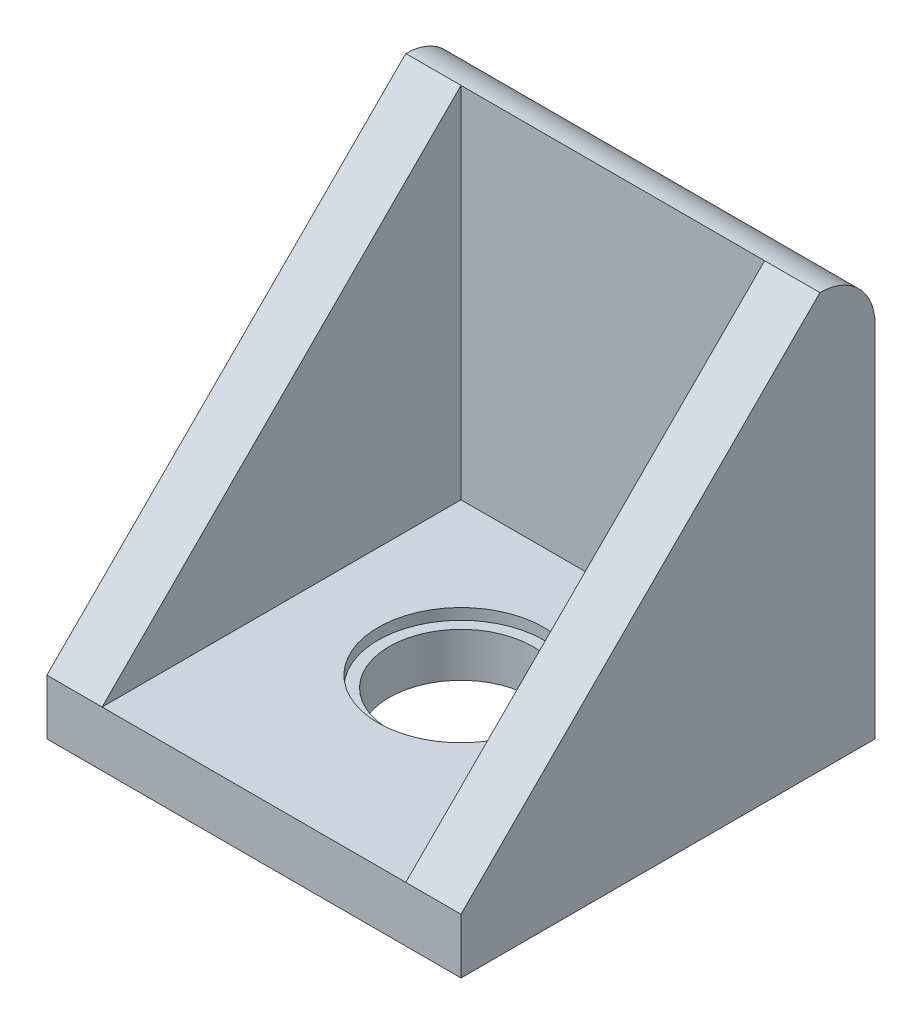
ISO-10303-21;
HEADER;
FILE_DESCRIPTION(('STEP AP214'),'2;1');
FILE_NAME('part.step','',(''),(''),'','','');
FILE_SCHEMA(('AUTOMOTIVE_DESIGN { 1 0 10303 214 1 1 1 1 }'));
ENDSEC;
DATA;
#1=APPLICATION_CONTEXT('core data for automotive mechanical design processes');
#2=APPLICATION_PROTOCOL_DEFINITION('international standard','automotive_design',2000,#1);
#3=PRODUCT_CONTEXT('',#1,'mechanical');
#4=PRODUCT('Part','Part','',(#3));
#5=PRODUCT_RELATED_PRODUCT_CATEGORY('part','',(#4));
#6=PRODUCT_DEFINITION_FORMATION('','',#4);
#7=PRODUCT_DEFINITION_CONTEXT('part definition',#1,'design');
#8=PRODUCT_DEFINITION('design','',#6,#7);
#9=PRODUCT_DEFINITION_SHAPE('','',#8);
#10=(LENGTH_UNIT() NAMED_UNIT(*) SI_UNIT(.MILLI.,.METRE.));
#11=(NAMED_UNIT(*) PLANE_ANGLE_UNIT() SI_UNIT($,.RADIAN.));
#12=(NAMED_UNIT(*) SI_UNIT($,.STERADIAN.) SOLID_ANGLE_UNIT());
#13=UNCERTAINTY_MEASURE_WITH_UNIT(LENGTH_MEASURE(1.E-05),#10,'distance_accuracy_value','');
#14=(GEOMETRIC_REPRESENTATION_CONTEXT(3) GLOBAL_UNCERTAINTY_ASSIGNED_CONTEXT((#13)) GLOBAL_UNIT_ASSIGNED_CONTEXT((#10,
#11,#12)) REPRESENTATION_CONTEXT('',''));
#15=CARTESIAN_POINT('',(0.,0.,0.));
#16=DIRECTION('',(0.,0.,1.));
#17=DIRECTION('',(1.,0.,0.));
#18=AXIS2_PLACEMENT_3D('',#15,#16,#17);
#19=CARTESIAN_POINT('',(0.,4.67695526217005,0.));
#20=DIRECTION('',(0.,-1.,0.));
#21=DIRECTION('',(0.,0.,-1.));
#22=AXIS2_PLACEMENT_3D('',#19,#20,#21);
#23=CYLINDRICAL_SURFACE('',#22,1.3);
#24=CARTESIAN_POINT('',(0.,0.,0.));
#25=DIRECTION('',(0.,-1.,0.));
#26=DIRECTION('',(0.,0.,-1.));
#27=AXIS2_PLACEMENT_3D('',#24,#25,#26);
#28=CIRCLE('',#27,1.3);
#29=CARTESIAN_POINT('',(0.,0.,-1.3));
#30=VERTEX_POINT('',#29);
#31=EDGE_CURVE('E117',#30,#30,#28,.T.);
#32=CARTESIAN_POINT('',(0.,0.8,0.));
#33=DIRECTION('',(0.,1.,0.));
#34=DIRECTION('',(0.,0.,1.));
#35=AXIS2_PLACEMENT_3D('',#32,#33,#34);
#36=CIRCLE('',#35,1.3);
#37=CARTESIAN_POINT('',(0.,0.8,-1.3));
#38=VERTEX_POINT('',#37);
#39=EDGE_CURVE('E134',#38,#38,#36,.F.);
#40=CARTESIAN_POINT('',(0.,0.,-1.3));
#41=CARTESIAN_POINT('',(0.,0.00833333333333328,-1.3));
#42=CARTESIAN_POINT('',(0.,0.0166666666666666,-1.3));
#43=CARTESIAN_POINT('',(0.,0.0333333333333331,-1.3));
#44=CARTESIAN_POINT('',(0.,0.0416666666666664,-1.3));
#45=CARTESIAN_POINT('',(0.,0.0583333333333333,-1.3));
#46=CARTESIAN_POINT('',(0.,0.0666666666666668,-1.3));
#47=CARTESIAN_POINT('',(0.,0.0833333333333337,-1.3));
#48=CARTESIAN_POINT('',(0.,0.091666666666667,-1.3));
#49=CARTESIAN_POINT('',(0.,0.108333333333334,-1.3));
#50=CARTESIAN_POINT('',(0.,0.116666666666667,-1.3));
#51=CARTESIAN_POINT('',(0.,0.133333333333333,-1.3));
#52=CARTESIAN_POINT('',(0.,0.141666666666667,-1.3));
#53=CARTESIAN_POINT('',(0.,0.158333333333333,-1.3));
#54=CARTESIAN_POINT('',(0.,0.166666666666667,-1.3));
#55=CARTESIAN_POINT('',(0.,0.183333333333333,-1.3));
#56=CARTESIAN_POINT('',(0.,0.191666666666667,-1.3));
#57=CARTESIAN_POINT('',(0.,0.208333333333334,-1.3));
#58=CARTESIAN_POINT('',(0.,0.216666666666667,-1.3));
#59=CARTESIAN_POINT('',(0.,0.233333333333334,-1.3));
#60=CARTESIAN_POINT('',(0.,0.241666666666667,-1.3));
#61=CARTESIAN_POINT('',(0.,0.258333333333334,-1.3));
#62=CARTESIAN_POINT('',(0.,0.266666666666667,-1.3));
#63=CARTESIAN_POINT('',(0.,0.283333333333333,-1.3));
#64=CARTESIAN_POINT('',(0.,0.291666666666667,-1.3));
#65=CARTESIAN_POINT('',(0.,0.308333333333333,-1.3));
#66=CARTESIAN_POINT('',(0.,0.316666666666666,-1.3));
#67=CARTESIAN_POINT('',(0.,0.333333333333333,-1.3));
#68=CARTESIAN_POINT('',(0.,0.341666666666667,-1.3));
#69=CARTESIAN_POINT('',(0.,0.358333333333334,-1.3));
#70=CARTESIAN_POINT('',(0.,0.366666666666667,-1.3));
#71=CARTESIAN_POINT('',(0.,0.383333333333334,-1.3));
#72=CARTESIAN_POINT('',(0.,0.391666666666667,-1.3));
#73=CARTESIAN_POINT('',(0.,0.408333333333333,-1.3));
#74=CARTESIAN_POINT('',(0.,0.416666666666667,-1.3));
#75=CARTESIAN_POINT('',(0.,0.433333333333333,-1.3));
#76=CARTESIAN_POINT('',(0.,0.441666666666667,-1.3));
#77=CARTESIAN_POINT('',(0.,0.458333333333333,-1.3));
#78=CARTESIAN_POINT('',(0.,0.466666666666667,-1.3));
#79=CARTESIAN_POINT('',(0.,0.483333333333334,-1.3));
#80=CARTESIAN_POINT('',(0.,0.491666666666667,-1.3));
#81=CARTESIAN_POINT('',(0.,0.508333333333334,-1.3));
#82=CARTESIAN_POINT('',(0.,0.516666666666667,-1.3));
#83=CARTESIAN_POINT('',(0.,0.533333333333334,-1.3));
#84=CARTESIAN_POINT('',(0.,0.541666666666667,-1.3));
#85=CARTESIAN_POINT('',(0.,0.558333333333333,-1.3));
#86=CARTESIAN_POINT('',(0.,0.566666666666667,-1.3));
#87=CARTESIAN_POINT('',(0.,0.583333333333333,-1.3));
#88=CARTESIAN_POINT('',(0.,0.591666666666667,-1.3));
#89=CARTESIAN_POINT('',(0.,0.608333333333333,-1.3));
#90=CARTESIAN_POINT('',(0.,0.616666666666667,-1.3));
#91=CARTESIAN_POINT('',(0.,0.633333333333334,-1.3));
#92=CARTESIAN_POINT('',(0.,0.641666666666667,-1.3));
#93=CARTESIAN_POINT('',(0.,0.658333333333334,-1.3));
#94=CARTESIAN_POINT('',(0.,0.666666666666667,-1.3));
#95=CARTESIAN_POINT('',(0.,0.683333333333334,-1.3));
#96=CARTESIAN_POINT('',(0.,0.691666666666667,-1.3));
#97=CARTESIAN_POINT('',(0.,0.708333333333333,-1.3));
#98=CARTESIAN_POINT('',(0.,0.716666666666667,-1.3));
#99=CARTESIAN_POINT('',(0.,0.733333333333334,-1.3));
#100=CARTESIAN_POINT('',(0.,0.741666666666667,-1.3));
#101=CARTESIAN_POINT('',(0.,0.758333333333334,-1.3));
#102=CARTESIAN_POINT('',(0.,0.766666666666667,-1.3));
#103=CARTESIAN_POINT('',(0.,0.783333333333333,-1.3));
#104=CARTESIAN_POINT('',(0.,0.791666666666667,-1.3));
#105=CARTESIAN_POINT('',(0.,0.8,-1.3));
#106=B_SPLINE_CURVE_WITH_KNOTS('',3,(#40,#41,#42,#43,#44,#45,#46,#47,#48,#49,#50,#51,#52,#53,
#54,#55,#56,#57,#58,#59,#60,#61,#62,#63,#64,#65,#66,#67,#68,#69,#70,#71,#72,#73,#74,#75,#76,#77,
#78,#79,#80,#81,#82,#83,#84,#85,#86,#87,#88,#89,#90,#91,#92,#93,#94,#95,#96,#97,#98,#99,#100,
#101,#102,#103,#104,#105),.UNSPECIFIED.,.F.,.F.,(4,2,2,2,2,2,2,2,2,2,2,2,2,2,2,2,2,2,2,2,2,2,2,
2,2,2,2,2,2,2,2,2,4),(0.,0.0249999999999998,0.0499999999999997,0.0750000000000004,0.1,0.125,
0.15,0.175,0.200000000000001,0.225,0.25,0.275,0.3,0.325,0.35,0.375,0.4,0.425,0.45,
0.475000000000001,0.5,0.525,0.55,0.575,0.6,0.625000000000001,0.65,0.675,0.7,0.725,
0.750000000000001,0.775,0.8),.UNSPECIFIED.);
#107=EDGE_CURVE('BSEAM33',#30,#38,#106,.T.);
#108=ORIENTED_EDGE('',*,*,#31,.T.);
#109=ORIENTED_EDGE('',*,*,#39,.F.);
#110=ORIENTED_EDGE('',*,*,#107,.T.);
#111=ORIENTED_EDGE('',*,*,#107,.F.);
#112=EDGE_LOOP('',(#108,#110,#109,#111));
#113=FACE_BOUND('',#112,.T.);
#114=ADVANCED_FACE('F33',(#113),#23,.F.);
#115=CARTESIAN_POINT('',(3.75,7.5,-3.75));
#116=DIRECTION('',(-1.,0.,0.));
#117=DIRECTION('',(0.,0.,1.));
#118=AXIS2_PLACEMENT_3D('',#115,#116,#117);
#119=PLANE('',#118);
#120=DIRECTION('',(0.,-1.,0.));
#121=VECTOR('',#120,1.);
#122=CARTESIAN_POINT('',(3.75,7.5,-3.75));
#123=LINE('',#122,#121);
#124=CARTESIAN_POINT('',(3.75,6.5,-3.75));
#125=VERTEX_POINT('',#124);
#126=CARTESIAN_POINT('',(3.75,0.,-3.75));
#127=VERTEX_POINT('',#126);
#128=EDGE_CURVE('E132',#125,#127,#123,.T.);
#129=ORIENTED_EDGE('',*,*,#128,.F.);
#130=CARTESIAN_POINT('',(3.75,6.5,-2.75));
#131=DIRECTION('',(-1.,0.,0.));
#132=DIRECTION('',(0.,0.,1.));
#133=AXIS2_PLACEMENT_3D('',#130,#131,#132);
#134=CIRCLE('',#133,1.);
#135=CARTESIAN_POINT('',(3.75,7.5,-2.75));
#136=VERTEX_POINT('',#135);
#137=EDGE_CURVE('E11',#125,#136,#134,.F.);
#138=ORIENTED_EDGE('',*,*,#137,.T.);
#139=DIRECTION('',(0.,0.707106781186548,-0.707106781186547));
#140=VECTOR('',#139,1.);
#141=CARTESIAN_POINT('',(3.75,7.5,-2.75));
#142=LINE('',#141,#140);
#143=CARTESIAN_POINT('',(3.75,1.,3.75));
#144=VERTEX_POINT('',#143);
#145=EDGE_CURVE('E101',#144,#136,#142,.T.);
#146=ORIENTED_EDGE('',*,*,#145,.F.);
#147=DIRECTION('',(0.,-1.,0.));
#148=VECTOR('',#147,1.);
#149=CARTESIAN_POINT('',(3.75,7.5,3.75));
#150=LINE('',#149,#148);
#151=CARTESIAN_POINT('',(3.75,0.,3.75));
#152=VERTEX_POINT('',#151);
#153=EDGE_CURVE('E114',#144,#152,#150,.T.);
#154=ORIENTED_EDGE('',*,*,#153,.T.);
#155=DIRECTION('',(0.,0.,-1.));
#156=VECTOR('',#155,1.);
#157=CARTESIAN_POINT('',(3.75,0.,-3.75));
#158=LINE('',#157,#156);
#159=EDGE_CURVE('E179',#152,#127,#158,.T.);
#160=ORIENTED_EDGE('',*,*,#159,.T.);
#161=EDGE_LOOP('',(#129,#138,#146,#154,#160));
#162=FACE_BOUND('',#161,.T.);
#163=ADVANCED_FACE('F112',(#162),#119,.F.);
#164=CARTESIAN_POINT('',(-3.75,7.5,-3.75));
#165=DIRECTION('',(0.,0.,1.));
#166=DIRECTION('',(1.,0.,0.));
#167=AXIS2_PLACEMENT_3D('',#164,#165,#166);
#168=PLANE('',#167);
#169=DIRECTION('',(0.,-1.,0.));
#170=VECTOR('',#169,1.);
#171=CARTESIAN_POINT('',(-3.75,7.5,-3.75));
#172=LINE('',#171,#170);
#173=CARTESIAN_POINT('',(-3.75,6.5,-3.75));
#174=VERTEX_POINT('',#173);
#175=CARTESIAN_POINT('',(-3.75,0.,-3.75));
#176=VERTEX_POINT('',#175);
#177=EDGE_CURVE('E125',#174,#176,#172,.T.);
#178=ORIENTED_EDGE('',*,*,#177,.F.);
#179=DIRECTION('',(-1.,0.,0.));
#180=VECTOR('',#179,1.);
#181=CARTESIAN_POINT('',(3.75,6.5,-3.75));
#182=LINE('',#181,#180);
#183=EDGE_CURVE('E41',#174,#125,#182,.F.);
#184=ORIENTED_EDGE('',*,*,#183,.T.);
#185=ORIENTED_EDGE('',*,*,#128,.T.);
#186=DIRECTION('',(-1.,0.,0.));
#187=VECTOR('',#186,1.);
#188=CARTESIAN_POINT('',(-3.75,0.,-3.75));
#189=LINE('',#188,#187);
#190=EDGE_CURVE('E183',#127,#176,#189,.T.);
#191=ORIENTED_EDGE('',*,*,#190,.T.);
#192=EDGE_LOOP('',(#178,#184,#185,#191));
#193=FACE_BOUND('',#192,.T.);
#194=ADVANCED_FACE('F222',(#193),#168,.F.);
#195=CARTESIAN_POINT('',(-3.75,7.5,-3.75));
#196=DIRECTION('',(1.,0.,0.));
#197=DIRECTION('',(0.,0.,-1.));
#198=AXIS2_PLACEMENT_3D('',#195,#196,#197);
#199=PLANE('',#198);
#200=DIRECTION('',(0.,-0.707106781186548,0.707106781186547));
#201=VECTOR('',#200,1.);
#202=CARTESIAN_POINT('',(-3.75,7.5,-2.75));
#203=LINE('',#202,#201);
#204=CARTESIAN_POINT('',(-3.75,7.5,-2.75));
#205=VERTEX_POINT('',#204);
#206=CARTESIAN_POINT('',(-3.75,1.,3.75));
#207=VERTEX_POINT('',#206);
#208=EDGE_CURVE('E152',#205,#207,#203,.T.);
#209=ORIENTED_EDGE('',*,*,#208,.F.);
#210=CARTESIAN_POINT('',(-3.75,6.5,-2.75));
#211=DIRECTION('',(1.,0.,0.));
#212=DIRECTION('',(0.,0.,-1.));
#213=AXIS2_PLACEMENT_3D('',#210,#211,#212);
#214=CIRCLE('',#213,1.);
#215=EDGE_CURVE('E55',#205,#174,#214,.F.);
#216=ORIENTED_EDGE('',*,*,#215,.T.);
#217=ORIENTED_EDGE('',*,*,#177,.T.);
#218=DIRECTION('',(0.,0.,1.));
#219=VECTOR('',#218,1.);
#220=CARTESIAN_POINT('',(-3.75,0.,-3.75));
#221=LINE('',#220,#219);
#222=CARTESIAN_POINT('',(-3.75,0.,3.75));
#223=VERTEX_POINT('',#222);
#224=EDGE_CURVE('E127',#176,#223,#221,.T.);
#225=ORIENTED_EDGE('',*,*,#224,.T.);
#226=DIRECTION('',(0.,-1.,0.));
#227=VECTOR('',#226,1.);
#228=CARTESIAN_POINT('',(-3.75,7.5,3.75));
#229=LINE('',#228,#227);
#230=EDGE_CURVE('E123',#207,#223,#229,.T.);
#231=ORIENTED_EDGE('',*,*,#230,.F.);
#232=EDGE_LOOP('',(#209,#216,#217,#225,#231));
#233=FACE_BOUND('',#232,.T.);
#234=ADVANCED_FACE('F188',(#233),#199,.F.);
#235=CARTESIAN_POINT('',(-3.75,7.5,3.75));
#236=DIRECTION('',(0.,0.,-1.));
#237=DIRECTION('',(-1.,0.,0.));
#238=AXIS2_PLACEMENT_3D('',#235,#236,#237);
#239=PLANE('',#238);
#240=ORIENTED_EDGE('',*,*,#153,.F.);
#241=DIRECTION('',(1.,0.,0.));
#242=VECTOR('',#241,1.);
#243=CARTESIAN_POINT('',(-12.9423881554251,1.,3.75));
#244=LINE('',#243,#242);
#245=CARTESIAN_POINT('',(2.75,1.,3.75));
#246=VERTEX_POINT('',#245);
#247=EDGE_CURVE('E97',#246,#144,#244,.T.);
#248=ORIENTED_EDGE('',*,*,#247,.F.);
#249=DIRECTION('',(1.,0.,0.));
#250=VECTOR('',#249,1.);
#251=CARTESIAN_POINT('',(-2.75,1.,3.75));
#252=LINE('',#251,#250);
#253=CARTESIAN_POINT('',(-2.75,1.,3.75));
#254=VERTEX_POINT('',#253);
#255=EDGE_CURVE('E164',#254,#246,#252,.T.);
#256=ORIENTED_EDGE('',*,*,#255,.F.);
#257=EDGE_CURVE('E109',#207,#254,#244,.T.);
#258=ORIENTED_EDGE('',*,*,#257,.F.);
#259=ORIENTED_EDGE('',*,*,#230,.T.);
#260=DIRECTION('',(1.,0.,0.));
#261=VECTOR('',#260,1.);
#262=CARTESIAN_POINT('',(-3.75,0.,3.75));
#263=LINE('',#262,#261);
#264=EDGE_CURVE('E121',#223,#152,#263,.T.);
#265=ORIENTED_EDGE('',*,*,#264,.T.);
#266=EDGE_LOOP('',(#240,#248,#256,#258,#259,#265));
#267=FACE_BOUND('',#266,.T.);
#268=ADVANCED_FACE('F119',(#267),#239,.F.);
#269=CARTESIAN_POINT('',(0.,0.,0.));
#270=DIRECTION('',(0.,1.,0.));
#271=DIRECTION('',(0.,0.,1.));
#272=AXIS2_PLACEMENT_3D('',#269,#270,#271);
#273=PLANE('',#272);
#274=ORIENTED_EDGE('',*,*,#31,.F.);
#275=EDGE_LOOP('',(#274));
#276=FACE_BOUND('',#275,.T.);
#277=ORIENTED_EDGE('',*,*,#159,.F.);
#278=ORIENTED_EDGE('',*,*,#264,.F.);
#279=ORIENTED_EDGE('',*,*,#224,.F.);
#280=ORIENTED_EDGE('',*,*,#190,.F.);
#281=EDGE_LOOP('',(#277,#278,#279,#280));
#282=FACE_BOUND('',#281,.T.);
#283=ADVANCED_FACE('F191',(#276,#282),#273,.F.);
#284=CARTESIAN_POINT('',(-2.75,1.,3.75));
#285=DIRECTION('',(-1.,0.,0.));
#286=DIRECTION('',(0.,0.,1.));
#287=AXIS2_PLACEMENT_3D('',#284,#285,#286);
#288=PLANE('',#287);
#289=DIRECTION('',(0.,1.,0.));
#290=VECTOR('',#289,1.);
#291=CARTESIAN_POINT('',(-2.75,1.,-2.75));
#292=LINE('',#291,#290);
#293=CARTESIAN_POINT('',(-2.75,1.,-2.75));
#294=VERTEX_POINT('',#293);
#295=CARTESIAN_POINT('',(-2.75,7.5,-2.75));
#296=VERTEX_POINT('',#295);
#297=EDGE_CURVE('E176',#294,#296,#292,.T.);
#298=ORIENTED_EDGE('',*,*,#297,.T.);
#299=DIRECTION('',(0.,-0.707106781186548,0.707106781186547));
#300=VECTOR('',#299,1.);
#301=CARTESIAN_POINT('',(-2.75,1.,3.75));
#302=LINE('',#301,#300);
#303=EDGE_CURVE('E157',#296,#254,#302,.T.);
#304=ORIENTED_EDGE('',*,*,#303,.T.);
#305=DIRECTION('',(0.,0.,1.));
#306=VECTOR('',#305,1.);
#307=CARTESIAN_POINT('',(-2.75,1.,3.75));
#308=LINE('',#307,#306);
#309=EDGE_CURVE('E161',#294,#254,#308,.T.);
#310=ORIENTED_EDGE('',*,*,#309,.F.);
#311=EDGE_LOOP('',(#298,#304,#310));
#312=FACE_BOUND('',#311,.T.);
#313=ADVANCED_FACE('F205',(#312),#288,.F.);
#314=CARTESIAN_POINT('',(-2.75,1.,-2.75));
#315=DIRECTION('',(0.,0.,-1.));
#316=DIRECTION('',(-1.,0.,0.));
#317=AXIS2_PLACEMENT_3D('',#314,#315,#316);
#318=PLANE('',#317);
#319=DIRECTION('',(-1.,0.,0.));
#320=VECTOR('',#319,1.);
#321=CARTESIAN_POINT('',(-2.75,7.5,-2.75));
#322=LINE('',#321,#320);
#323=CARTESIAN_POINT('',(2.75,7.5,-2.75));
#324=VERTEX_POINT('',#323);
#325=EDGE_CURVE('E160',#324,#296,#322,.T.);
#326=ORIENTED_EDGE('',*,*,#325,.T.);
#327=ORIENTED_EDGE('',*,*,#297,.F.);
#328=DIRECTION('',(-1.,0.,0.));
#329=VECTOR('',#328,1.);
#330=CARTESIAN_POINT('',(-2.75,1.,-2.75));
#331=LINE('',#330,#329);
#332=CARTESIAN_POINT('',(2.75,1.,-2.75));
#333=VERTEX_POINT('',#332);
#334=EDGE_CURVE('E170',#333,#294,#331,.T.);
#335=ORIENTED_EDGE('',*,*,#334,.F.);
#336=DIRECTION('',(0.,1.,0.));
#337=VECTOR('',#336,1.);
#338=CARTESIAN_POINT('',(2.75,1.,-2.75));
#339=LINE('',#338,#337);
#340=EDGE_CURVE('E173',#333,#324,#339,.T.);
#341=ORIENTED_EDGE('',*,*,#340,.T.);
#342=EDGE_LOOP('',(#326,#327,#335,#341));
#343=FACE_BOUND('',#342,.T.);
#344=ADVANCED_FACE('F197',(#343),#318,.F.);
#345=CARTESIAN_POINT('',(2.75,1.,3.75));
#346=DIRECTION('',(1.,0.,0.));
#347=DIRECTION('',(0.,0.,-1.));
#348=AXIS2_PLACEMENT_3D('',#345,#346,#347);
#349=PLANE('',#348);
#350=DIRECTION('',(0.,0.,-1.));
#351=VECTOR('',#350,1.);
#352=CARTESIAN_POINT('',(2.75,1.,3.75));
#353=LINE('',#352,#351);
#354=EDGE_CURVE('E167',#246,#333,#353,.T.);
#355=ORIENTED_EDGE('',*,*,#354,.F.);
#356=DIRECTION('',(0.,0.707106781186548,-0.707106781186547));
#357=VECTOR('',#356,1.);
#358=CARTESIAN_POINT('',(2.75,1.,3.75));
#359=LINE('',#358,#357);
#360=EDGE_CURVE('E104',#246,#324,#359,.T.);
#361=ORIENTED_EDGE('',*,*,#360,.T.);
#362=ORIENTED_EDGE('',*,*,#340,.F.);
#363=EDGE_LOOP('',(#355,#361,#362));
#364=FACE_BOUND('',#363,.T.);
#365=ADVANCED_FACE('F194',(#364),#349,.F.);
#366=CARTESIAN_POINT('',(0.,1.,0.));
#367=DIRECTION('',(0.,-1.,0.));
#368=DIRECTION('',(0.,0.,-1.));
#369=AXIS2_PLACEMENT_3D('',#366,#367,#368);
#370=PLANE('',#369);
#371=CARTESIAN_POINT('',(0.,1.,0.));
#372=DIRECTION('',(0.,1.,0.));
#373=DIRECTION('',(0.,0.,1.));
#374=AXIS2_PLACEMENT_3D('',#371,#372,#373);
#375=CIRCLE('',#374,1.5);
#376=CARTESIAN_POINT('',(0.,1.,1.5));
#377=VERTEX_POINT('',#376);
#378=EDGE_CURVE('E143',#377,#377,#375,.T.);
#379=ORIENTED_EDGE('',*,*,#378,.F.);
#380=EDGE_LOOP('',(#379));
#381=FACE_BOUND('',#380,.T.);
#382=ORIENTED_EDGE('',*,*,#309,.T.);
#383=ORIENTED_EDGE('',*,*,#255,.T.);
#384=ORIENTED_EDGE('',*,*,#354,.T.);
#385=ORIENTED_EDGE('',*,*,#334,.T.);
#386=EDGE_LOOP('',(#382,#383,#384,#385));
#387=FACE_BOUND('',#386,.T.);
#388=ADVANCED_FACE('F200',(#381,#387),#370,.F.);
#389=CARTESIAN_POINT('',(-12.9423881554251,7.5,-2.75));
#390=DIRECTION('',(0.,-0.707106781186547,-0.707106781186548));
#391=DIRECTION('',(0.,0.707106781186548,-0.707106781186547));
#392=AXIS2_PLACEMENT_3D('',#389,#390,#391);
#393=PLANE('',#392);
#394=ORIENTED_EDGE('',*,*,#247,.T.);
#395=ORIENTED_EDGE('',*,*,#145,.T.);
#396=DIRECTION('',(1.,0.,0.));
#397=VECTOR('',#396,1.);
#398=CARTESIAN_POINT('',(-12.9423881554251,7.5,-2.75));
#399=LINE('',#398,#397);
#400=EDGE_CURVE('E153',#324,#136,#399,.T.);
#401=ORIENTED_EDGE('',*,*,#400,.F.);
#402=ORIENTED_EDGE('',*,*,#360,.F.);
#403=EDGE_LOOP('',(#394,#395,#401,#402));
#404=FACE_BOUND('',#403,.T.);
#405=ADVANCED_FACE('F99',(#404),#393,.F.);
#406=EDGE_CURVE('E150',#205,#296,#399,.T.);
#407=ORIENTED_EDGE('',*,*,#406,.F.);
#408=ORIENTED_EDGE('',*,*,#208,.T.);
#409=ORIENTED_EDGE('',*,*,#257,.T.);
#410=ORIENTED_EDGE('',*,*,#303,.F.);
#411=EDGE_LOOP('',(#407,#408,#409,#410));
#412=FACE_BOUND('',#411,.T.);
#413=ADVANCED_FACE('F203',(#412),#393,.F.);
#414=CARTESIAN_POINT('',(0.,0.8,0.));
#415=DIRECTION('',(0.,1.,0.));
#416=DIRECTION('',(0.,0.,1.));
#417=AXIS2_PLACEMENT_3D('',#414,#415,#416);
#418=PLANE('',#417);
#419=CARTESIAN_POINT('',(0.,0.8,0.));
#420=DIRECTION('',(0.,1.,0.));
#421=DIRECTION('',(0.,0.,1.));
#422=AXIS2_PLACEMENT_3D('',#419,#420,#421);
#423=CIRCLE('',#422,1.5);
#424=CARTESIAN_POINT('',(0.,0.8,1.5));
#425=VERTEX_POINT('',#424);
#426=EDGE_CURVE('E137',#425,#425,#423,.T.);
#427=ORIENTED_EDGE('',*,*,#426,.T.);
#428=EDGE_LOOP('',(#427));
#429=FACE_BOUND('',#428,.T.);
#430=ORIENTED_EDGE('',*,*,#39,.T.);
#431=EDGE_LOOP('',(#430));
#432=FACE_BOUND('',#431,.T.);
#433=ADVANCED_FACE('F230',(#429,#432),#418,.T.);
#434=CARTESIAN_POINT('',(0.,0.8,0.));
#435=DIRECTION('',(0.,1.,0.));
#436=DIRECTION('',(0.,0.,1.));
#437=AXIS2_PLACEMENT_3D('',#434,#435,#436);
#438=CYLINDRICAL_SURFACE('',#437,1.5);
#439=ORIENTED_EDGE('',*,*,#426,.F.);
#440=EDGE_LOOP('',(#439));
#441=FACE_BOUND('',#440,.T.);
#442=ORIENTED_EDGE('',*,*,#378,.T.);
#443=EDGE_LOOP('',(#442));
#444=FACE_BOUND('',#443,.T.);
#445=ADVANCED_FACE('F226',(#441,#444),#438,.F.);
#446=CARTESIAN_POINT('',(0.,6.5,-2.75));
#447=DIRECTION('',(1.,0.,0.));
#448=DIRECTION('',(0.,0.,-1.));
#449=AXIS2_PLACEMENT_3D('',#446,#447,#448);
#450=CYLINDRICAL_SURFACE('',#449,1.);
#451=ORIENTED_EDGE('',*,*,#137,.F.);
#452=ORIENTED_EDGE('',*,*,#183,.F.);
#453=ORIENTED_EDGE('',*,*,#215,.F.);
#454=ORIENTED_EDGE('',*,*,#406,.T.);
#455=ORIENTED_EDGE('',*,*,#325,.F.);
#456=ORIENTED_EDGE('',*,*,#400,.T.);
#457=EDGE_LOOP('',(#451,#452,#453,#454,#455,#456));
#458=FACE_BOUND('',#457,.T.);
#459=ADVANCED_FACE('F35',(#458),#450,.T.);
#460=CLOSED_SHELL('',(#114,#163,#194,#234,#268,#283,#313,#344,#365,#388,#405,#413,#433,#445,#459));
#461=MANIFOLD_SOLID_BREP('B2',#460);
#462=ADVANCED_BREP_SHAPE_REPRESENTATION('',(#18,#461),#14);
#463=SHAPE_DEFINITION_REPRESENTATION(#9,#462);
ENDSEC;
END-ISO-10303-21;
